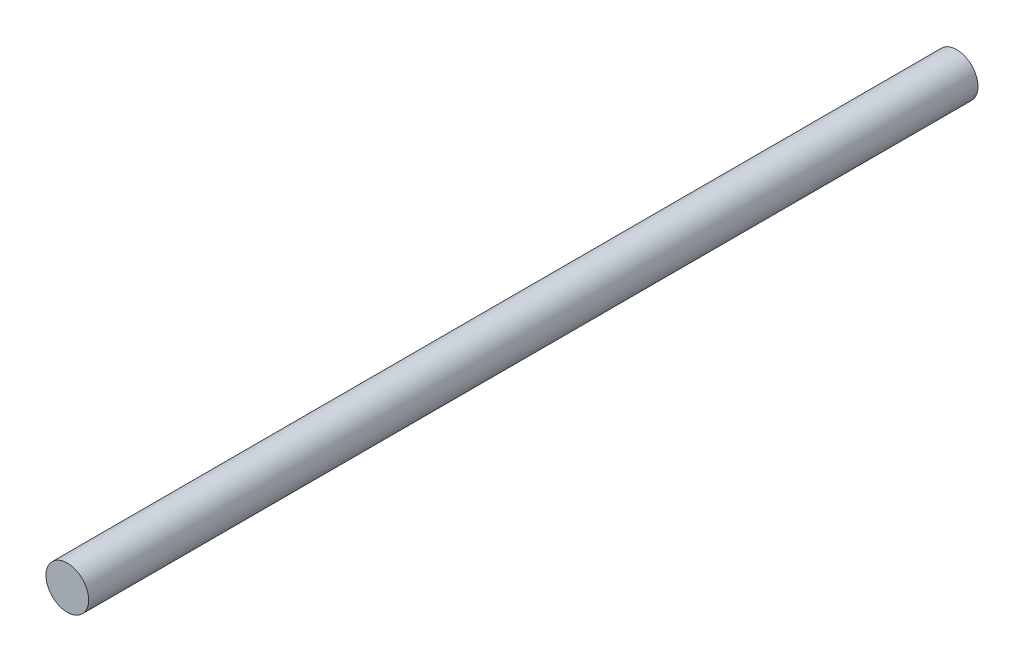
ISO-10303-21;
HEADER;
FILE_DESCRIPTION(('STEP AP214'),'2;1');
FILE_NAME('part.step','',(''),(''),'','','');
FILE_SCHEMA(('AUTOMOTIVE_DESIGN { 1 0 10303 214 1 1 1 1 }'));
ENDSEC;
DATA;
#1=APPLICATION_CONTEXT('core data for automotive mechanical design processes');
#2=APPLICATION_PROTOCOL_DEFINITION('international standard','automotive_design',2000,#1);
#3=PRODUCT_CONTEXT('',#1,'mechanical');
#4=PRODUCT('Part','Part','',(#3));
#5=PRODUCT_RELATED_PRODUCT_CATEGORY('part','',(#4));
#6=PRODUCT_DEFINITION_FORMATION('','',#4);
#7=PRODUCT_DEFINITION_CONTEXT('part definition',#1,'design');
#8=PRODUCT_DEFINITION('design','',#6,#7);
#9=PRODUCT_DEFINITION_SHAPE('','',#8);
#10=(LENGTH_UNIT() NAMED_UNIT(*) SI_UNIT(.MILLI.,.METRE.));
#11=(NAMED_UNIT(*) PLANE_ANGLE_UNIT() SI_UNIT($,.RADIAN.));
#12=(NAMED_UNIT(*) SI_UNIT($,.STERADIAN.) SOLID_ANGLE_UNIT());
#13=UNCERTAINTY_MEASURE_WITH_UNIT(LENGTH_MEASURE(1.E-05),#10,'distance_accuracy_value','');
#14=(GEOMETRIC_REPRESENTATION_CONTEXT(3) GLOBAL_UNCERTAINTY_ASSIGNED_CONTEXT((#13)) GLOBAL_UNIT_ASSIGNED_CONTEXT((#10,
#11,#12)) REPRESENTATION_CONTEXT('',''));
#15=CARTESIAN_POINT('',(0.,0.,0.));
#16=DIRECTION('',(0.,0.,1.));
#17=DIRECTION('',(1.,0.,0.));
#18=AXIS2_PLACEMENT_3D('',#15,#16,#17);
#19=CARTESIAN_POINT('',(0.,0.,125.));
#20=DIRECTION('',(0.,0.,-1.));
#21=DIRECTION('',(-1.,0.,0.));
#22=AXIS2_PLACEMENT_3D('',#19,#20,#21);
#23=CYLINDRICAL_SURFACE('',#22,3.);
#24=CARTESIAN_POINT('',(0.,0.,125.));
#25=DIRECTION('',(0.,0.,1.));
#26=DIRECTION('',(1.,0.,0.));
#27=AXIS2_PLACEMENT_3D('',#24,#25,#26);
#28=CIRCLE('',#27,3.);
#29=CARTESIAN_POINT('',(3.,0.,125.));
#30=VERTEX_POINT('',#29);
#31=EDGE_CURVE('E10',#30,#30,#28,.T.);
#32=ORIENTED_EDGE('',*,*,#31,.F.);
#33=EDGE_LOOP('',(#32));
#34=FACE_BOUND('',#33,.T.);
#35=CARTESIAN_POINT('',(0.,0.,0.));
#36=DIRECTION('',(0.,0.,1.));
#37=DIRECTION('',(1.,0.,0.));
#38=AXIS2_PLACEMENT_3D('',#35,#36,#37);
#39=CIRCLE('',#38,3.);
#40=CARTESIAN_POINT('',(3.,0.,0.));
#41=VERTEX_POINT('',#40);
#42=EDGE_CURVE('E34',#41,#41,#39,.T.);
#43=ORIENTED_EDGE('',*,*,#42,.T.);
#44=EDGE_LOOP('',(#43));
#45=FACE_BOUND('',#44,.T.);
#46=ADVANCED_FACE('F31',(#34,#45),#23,.T.);
#47=CARTESIAN_POINT('',(0.,0.,125.));
#48=DIRECTION('',(0.,0.,1.));
#49=DIRECTION('',(1.,0.,0.));
#50=AXIS2_PLACEMENT_3D('',#47,#48,#49);
#51=PLANE('',#50);
#52=ORIENTED_EDGE('',*,*,#31,.T.);
#53=EDGE_LOOP('',(#52));
#54=FACE_BOUND('',#53,.T.);
#55=ADVANCED_FACE('F46',(#54),#51,.T.);
#56=CARTESIAN_POINT('',(0.,0.,0.));
#57=DIRECTION('',(0.,0.,1.));
#58=DIRECTION('',(1.,0.,0.));
#59=AXIS2_PLACEMENT_3D('',#56,#57,#58);
#60=PLANE('',#59);
#61=ORIENTED_EDGE('',*,*,#42,.F.);
#62=EDGE_LOOP('',(#61));
#63=FACE_BOUND('',#62,.T.);
#64=ADVANCED_FACE('F44',(#63),#60,.F.);
#65=CLOSED_SHELL('',(#46,#55,#64));
#66=MANIFOLD_SOLID_BREP('B2',#65);
#67=ADVANCED_BREP_SHAPE_REPRESENTATION('',(#18,#66),#14);
#68=SHAPE_DEFINITION_REPRESENTATION(#9,#67);
ENDSEC;
END-ISO-10303-21;
